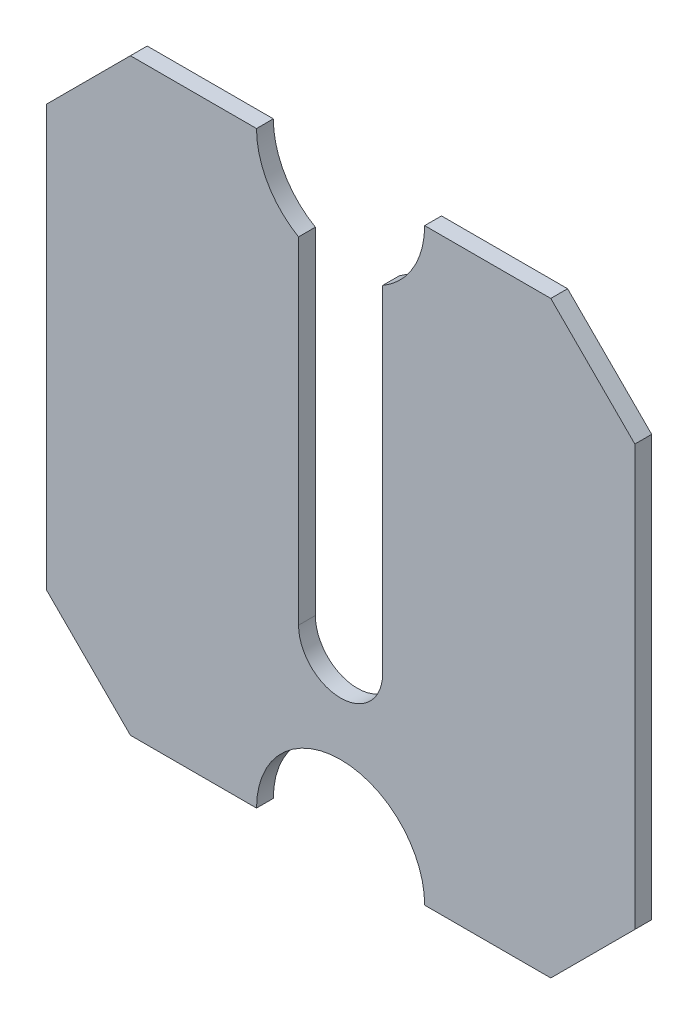
ISO-10303-21;
HEADER;
FILE_DESCRIPTION(('STEP AP214'),'2;1');
FILE_NAME('part.step','',(''),(''),'','','');
FILE_SCHEMA(('AUTOMOTIVE_DESIGN { 1 0 10303 214 1 1 1 1 }'));
ENDSEC;
DATA;
#1=APPLICATION_CONTEXT('core data for automotive mechanical design processes');
#2=APPLICATION_PROTOCOL_DEFINITION('international standard','automotive_design',2000,#1);
#3=PRODUCT_CONTEXT('',#1,'mechanical');
#4=PRODUCT('Part','Part','',(#3));
#5=PRODUCT_RELATED_PRODUCT_CATEGORY('part','',(#4));
#6=PRODUCT_DEFINITION_FORMATION('','',#4);
#7=PRODUCT_DEFINITION_CONTEXT('part definition',#1,'design');
#8=PRODUCT_DEFINITION('design','',#6,#7);
#9=PRODUCT_DEFINITION_SHAPE('','',#8);
#10=(LENGTH_UNIT() NAMED_UNIT(*) SI_UNIT(.MILLI.,.METRE.));
#11=(NAMED_UNIT(*) PLANE_ANGLE_UNIT() SI_UNIT($,.RADIAN.));
#12=(NAMED_UNIT(*) SI_UNIT($,.STERADIAN.) SOLID_ANGLE_UNIT());
#13=UNCERTAINTY_MEASURE_WITH_UNIT(LENGTH_MEASURE(1.E-05),#10,'distance_accuracy_value','');
#14=(GEOMETRIC_REPRESENTATION_CONTEXT(3) GLOBAL_UNCERTAINTY_ASSIGNED_CONTEXT((#13)) GLOBAL_UNIT_ASSIGNED_CONTEXT((#10,
#11,#12)) REPRESENTATION_CONTEXT('',''));
#15=CARTESIAN_POINT('',(0.,0.,0.));
#16=DIRECTION('',(0.,0.,1.));
#17=DIRECTION('',(1.,0.,0.));
#18=AXIS2_PLACEMENT_3D('',#15,#16,#17);
#19=CARTESIAN_POINT('',(-150.412459493557,24.5875405064432,10.));
#20=DIRECTION('',(0.,0.,-1.));
#21=DIRECTION('',(-1.,0.,0.));
#22=AXIS2_PLACEMENT_3D('',#19,#20,#21);
#23=CYLINDRICAL_SURFACE('',#22,50.);
#24=CARTESIAN_POINT('',(-150.412459493557,24.5875405064432,0.));
#25=DIRECTION('',(0.,0.,-1.));
#26=DIRECTION('',(1.,0.,0.));
#27=AXIS2_PLACEMENT_3D('',#24,#25,#26);
#28=CIRCLE('',#27,50.);
#29=CARTESIAN_POINT('',(-200.412459493557,24.5875405064432,0.));
#30=VERTEX_POINT('',#29);
#31=CARTESIAN_POINT('',(-100.412459493557,24.5875405064432,0.));
#32=VERTEX_POINT('',#31);
#33=EDGE_CURVE('E180',#30,#32,#28,.T.);
#34=ORIENTED_EDGE('',*,*,#33,.T.);
#35=DIRECTION('',(0.,0.,-1.));
#36=VECTOR('',#35,1.);
#37=CARTESIAN_POINT('',(-100.412459493557,24.5875405064432,10.));
#38=LINE('',#37,#36);
#39=CARTESIAN_POINT('',(-100.412459493557,24.5875405064432,10.));
#40=VERTEX_POINT('',#39);
#41=EDGE_CURVE('E11',#40,#32,#38,.T.);
#42=ORIENTED_EDGE('',*,*,#41,.F.);
#43=CARTESIAN_POINT('',(-150.412459493557,24.5875405064432,10.));
#44=DIRECTION('',(0.,0.,-1.));
#45=DIRECTION('',(1.,0.,0.));
#46=AXIS2_PLACEMENT_3D('',#43,#44,#45);
#47=CIRCLE('',#46,50.);
#48=CARTESIAN_POINT('',(-200.412459493557,24.5875405064432,10.));
#49=VERTEX_POINT('',#48);
#50=EDGE_CURVE('E210',#49,#40,#47,.T.);
#51=ORIENTED_EDGE('',*,*,#50,.F.);
#52=DIRECTION('',(0.,0.,-1.));
#53=VECTOR('',#52,1.);
#54=CARTESIAN_POINT('',(-200.412459493557,24.5875405064432,10.));
#55=LINE('',#54,#53);
#56=EDGE_CURVE('E176',#49,#30,#55,.T.);
#57=ORIENTED_EDGE('',*,*,#56,.T.);
#58=EDGE_LOOP('',(#34,#42,#51,#57));
#59=FACE_BOUND('',#58,.T.);
#60=ADVANCED_FACE('F36',(#59),#23,.F.);
#61=CARTESIAN_POINT('',(-100.412459493557,24.5875405064432,10.));
#62=DIRECTION('',(0.,1.,0.));
#63=DIRECTION('',(0.,0.,1.));
#64=AXIS2_PLACEMENT_3D('',#61,#62,#63);
#65=PLANE('',#64);
#66=DIRECTION('',(1.,0.,0.));
#67=VECTOR('',#66,1.);
#68=CARTESIAN_POINT('',(-100.412459493557,24.5875405064432,0.));
#69=LINE('',#68,#67);
#70=CARTESIAN_POINT('',(-25.4124594935567,24.5875405064432,0.));
#71=VERTEX_POINT('',#70);
#72=EDGE_CURVE('E183',#32,#71,#69,.T.);
#73=ORIENTED_EDGE('',*,*,#72,.T.);
#74=DIRECTION('',(0.,0.,-1.));
#75=VECTOR('',#74,1.);
#76=CARTESIAN_POINT('',(-25.4124594935567,24.5875405064432,10.));
#77=LINE('',#76,#75);
#78=CARTESIAN_POINT('',(-25.4124594935567,24.5875405064432,10.));
#79=VERTEX_POINT('',#78);
#80=EDGE_CURVE('E44',#79,#71,#77,.T.);
#81=ORIENTED_EDGE('',*,*,#80,.F.);
#82=DIRECTION('',(1.,0.,0.));
#83=VECTOR('',#82,1.);
#84=CARTESIAN_POINT('',(-100.412459493557,24.5875405064432,10.));
#85=LINE('',#84,#83);
#86=EDGE_CURVE('E119',#40,#79,#85,.T.);
#87=ORIENTED_EDGE('',*,*,#86,.F.);
#88=ORIENTED_EDGE('',*,*,#41,.T.);
#89=EDGE_LOOP('',(#73,#81,#87,#88));
#90=FACE_BOUND('',#89,.T.);
#91=ADVANCED_FACE('F308',(#90),#65,.F.);
#92=CARTESIAN_POINT('',(-25.4124594935567,24.5875405064432,10.));
#93=DIRECTION('',(-0.707106781186547,0.707106781186548,0.));
#94=DIRECTION('',(-0.707106781186548,-0.707106781186547,0.));
#95=AXIS2_PLACEMENT_3D('',#92,#93,#94);
#96=PLANE('',#95);
#97=DIRECTION('',(0.707106781186548,0.707106781186547,0.));
#98=VECTOR('',#97,1.);
#99=CARTESIAN_POINT('',(-25.4124594935567,24.5875405064432,0.));
#100=LINE('',#99,#98);
#101=CARTESIAN_POINT('',(24.5875405064433,74.5875405064432,0.));
#102=VERTEX_POINT('',#101);
#103=EDGE_CURVE('E185',#71,#102,#100,.T.);
#104=ORIENTED_EDGE('',*,*,#103,.T.);
#105=DIRECTION('',(0.,0.,-1.));
#106=VECTOR('',#105,1.);
#107=CARTESIAN_POINT('',(24.5875405064433,74.5875405064432,10.));
#108=LINE('',#107,#106);
#109=CARTESIAN_POINT('',(24.5875405064433,74.5875405064432,10.));
#110=VERTEX_POINT('',#109);
#111=EDGE_CURVE('E241',#110,#102,#108,.T.);
#112=ORIENTED_EDGE('',*,*,#111,.F.);
#113=DIRECTION('',(0.707106781186548,0.707106781186547,0.));
#114=VECTOR('',#113,1.);
#115=CARTESIAN_POINT('',(-25.4124594935567,24.5875405064432,10.));
#116=LINE('',#115,#114);
#117=EDGE_CURVE('E249',#79,#110,#116,.T.);
#118=ORIENTED_EDGE('',*,*,#117,.F.);
#119=ORIENTED_EDGE('',*,*,#80,.T.);
#120=EDGE_LOOP('',(#104,#112,#118,#119));
#121=FACE_BOUND('',#120,.T.);
#122=ADVANCED_FACE('F247',(#121),#96,.F.);
#123=CARTESIAN_POINT('',(24.5875405064433,74.5875405064432,10.));
#124=DIRECTION('',(-1.,0.,0.));
#125=DIRECTION('',(0.,0.,1.));
#126=AXIS2_PLACEMENT_3D('',#123,#124,#125);
#127=PLANE('',#126);
#128=DIRECTION('',(0.,1.,0.));
#129=VECTOR('',#128,1.);
#130=CARTESIAN_POINT('',(24.5875405064433,74.5875405064432,0.));
#131=LINE('',#130,#129);
#132=CARTESIAN_POINT('',(24.5875405064433,324.587540506443,0.));
#133=VERTEX_POINT('',#132);
#134=EDGE_CURVE('E187',#102,#133,#131,.T.);
#135=ORIENTED_EDGE('',*,*,#134,.T.);
#136=DIRECTION('',(0.,0.,-1.));
#137=VECTOR('',#136,1.);
#138=CARTESIAN_POINT('',(24.5875405064433,324.587540506443,10.));
#139=LINE('',#138,#137);
#140=CARTESIAN_POINT('',(24.5875405064433,324.587540506443,10.));
#141=VERTEX_POINT('',#140);
#142=EDGE_CURVE('E238',#141,#133,#139,.T.);
#143=ORIENTED_EDGE('',*,*,#142,.F.);
#144=DIRECTION('',(0.,1.,0.));
#145=VECTOR('',#144,1.);
#146=CARTESIAN_POINT('',(24.5875405064433,74.5875405064432,10.));
#147=LINE('',#146,#145);
#148=EDGE_CURVE('E267',#110,#141,#147,.T.);
#149=ORIENTED_EDGE('',*,*,#148,.F.);
#150=ORIENTED_EDGE('',*,*,#111,.T.);
#151=EDGE_LOOP('',(#135,#143,#149,#150));
#152=FACE_BOUND('',#151,.T.);
#153=ADVANCED_FACE('F258',(#152),#127,.F.);
#154=CARTESIAN_POINT('',(-25.4124594935566,374.587540506443,10.));
#155=DIRECTION('',(-0.707106781186547,-0.707106781186548,0.));
#156=DIRECTION('',(0.707106781186548,-0.707106781186547,0.));
#157=AXIS2_PLACEMENT_3D('',#154,#155,#156);
#158=PLANE('',#157);
#159=DIRECTION('',(-0.707106781186548,0.707106781186547,0.));
#160=VECTOR('',#159,1.);
#161=CARTESIAN_POINT('',(-25.4124594935566,374.587540506443,0.));
#162=LINE('',#161,#160);
#163=CARTESIAN_POINT('',(-25.4124594935566,374.587540506443,0.));
#164=VERTEX_POINT('',#163);
#165=EDGE_CURVE('E189',#133,#164,#162,.T.);
#166=ORIENTED_EDGE('',*,*,#165,.T.);
#167=DIRECTION('',(0.,0.,-1.));
#168=VECTOR('',#167,1.);
#169=CARTESIAN_POINT('',(-25.4124594935566,374.587540506443,10.));
#170=LINE('',#169,#168);
#171=CARTESIAN_POINT('',(-25.4124594935566,374.587540506443,10.));
#172=VERTEX_POINT('',#171);
#173=EDGE_CURVE('E235',#172,#164,#170,.T.);
#174=ORIENTED_EDGE('',*,*,#173,.F.);
#175=DIRECTION('',(-0.707106781186548,0.707106781186547,0.));
#176=VECTOR('',#175,1.);
#177=CARTESIAN_POINT('',(-25.4124594935566,374.587540506443,10.));
#178=LINE('',#177,#176);
#179=EDGE_CURVE('E264',#141,#172,#178,.T.);
#180=ORIENTED_EDGE('',*,*,#179,.F.);
#181=ORIENTED_EDGE('',*,*,#142,.T.);
#182=EDGE_LOOP('',(#166,#174,#180,#181));
#183=FACE_BOUND('',#182,.T.);
#184=ADVANCED_FACE('F262',(#183),#158,.F.);
#185=CARTESIAN_POINT('',(-25.4124594935566,374.587540506443,10.));
#186=DIRECTION('',(0.,-1.,0.));
#187=DIRECTION('',(0.,0.,-1.));
#188=AXIS2_PLACEMENT_3D('',#185,#186,#187);
#189=PLANE('',#188);
#190=DIRECTION('',(-1.,0.,0.));
#191=VECTOR('',#190,1.);
#192=CARTESIAN_POINT('',(-25.4124594935566,374.587540506443,0.));
#193=LINE('',#192,#191);
#194=CARTESIAN_POINT('',(-100.412459493557,374.587540506443,0.));
#195=VERTEX_POINT('',#194);
#196=EDGE_CURVE('E191',#164,#195,#193,.T.);
#197=ORIENTED_EDGE('',*,*,#196,.T.);
#198=DIRECTION('',(0.,0.,-1.));
#199=VECTOR('',#198,1.);
#200=CARTESIAN_POINT('',(-100.412459493557,374.587540506443,10.));
#201=LINE('',#200,#199);
#202=CARTESIAN_POINT('',(-100.412459493557,374.587540506443,10.));
#203=VERTEX_POINT('',#202);
#204=EDGE_CURVE('E232',#203,#195,#201,.T.);
#205=ORIENTED_EDGE('',*,*,#204,.F.);
#206=DIRECTION('',(-1.,0.,0.));
#207=VECTOR('',#206,1.);
#208=CARTESIAN_POINT('',(-25.4124594935566,374.587540506443,10.));
#209=LINE('',#208,#207);
#210=EDGE_CURVE('E266',#172,#203,#209,.T.);
#211=ORIENTED_EDGE('',*,*,#210,.F.);
#212=ORIENTED_EDGE('',*,*,#173,.T.);
#213=EDGE_LOOP('',(#197,#205,#211,#212));
#214=FACE_BOUND('',#213,.T.);
#215=ADVANCED_FACE('F321',(#214),#189,.F.);
#216=CARTESIAN_POINT('',(-150.412459493557,374.587540506443,10.));
#217=DIRECTION('',(0.,0.,-1.));
#218=DIRECTION('',(-1.,0.,0.));
#219=AXIS2_PLACEMENT_3D('',#216,#217,#218);
#220=CYLINDRICAL_SURFACE('',#219,50.);
#221=CARTESIAN_POINT('',(-150.412459493557,374.587540506443,0.));
#222=DIRECTION('',(0.,0.,-1.));
#223=DIRECTION('',(1.,0.,0.));
#224=AXIS2_PLACEMENT_3D('',#221,#222,#223);
#225=CIRCLE('',#224,50.);
#226=CARTESIAN_POINT('',(-125.412459493557,331.286270317221,0.));
#227=VERTEX_POINT('',#226);
#228=EDGE_CURVE('E193',#195,#227,#225,.T.);
#229=ORIENTED_EDGE('',*,*,#228,.T.);
#230=DIRECTION('',(0.,0.,-1.));
#231=VECTOR('',#230,1.);
#232=CARTESIAN_POINT('',(-125.412459493557,331.286270317221,10.));
#233=LINE('',#232,#231);
#234=CARTESIAN_POINT('',(-125.412459493557,331.286270317221,10.));
#235=VERTEX_POINT('',#234);
#236=EDGE_CURVE('E229',#235,#227,#233,.T.);
#237=ORIENTED_EDGE('',*,*,#236,.F.);
#238=CARTESIAN_POINT('',(-150.412459493557,374.587540506443,10.));
#239=DIRECTION('',(0.,0.,-1.));
#240=DIRECTION('',(1.,0.,0.));
#241=AXIS2_PLACEMENT_3D('',#238,#239,#240);
#242=CIRCLE('',#241,50.);
#243=EDGE_CURVE('E269',#203,#235,#242,.T.);
#244=ORIENTED_EDGE('',*,*,#243,.F.);
#245=ORIENTED_EDGE('',*,*,#204,.T.);
#246=EDGE_LOOP('',(#229,#237,#244,#245));
#247=FACE_BOUND('',#246,.T.);
#248=ADVANCED_FACE('F324',(#247),#220,.F.);
#249=CARTESIAN_POINT('',(-125.412459493557,331.286270317221,10.));
#250=DIRECTION('',(1.,0.,0.));
#251=DIRECTION('',(0.,1.,0.));
#252=AXIS2_PLACEMENT_3D('',#249,#250,#251);
#253=PLANE('',#252);
#254=DIRECTION('',(0.,-1.,0.));
#255=VECTOR('',#254,1.);
#256=CARTESIAN_POINT('',(-125.412459493557,331.286270317221,0.));
#257=LINE('',#256,#255);
#258=CARTESIAN_POINT('',(-125.412459493557,131.286270317221,0.));
#259=VERTEX_POINT('',#258);
#260=EDGE_CURVE('E195',#227,#259,#257,.T.);
#261=ORIENTED_EDGE('',*,*,#260,.T.);
#262=DIRECTION('',(0.,0.,-1.));
#263=VECTOR('',#262,1.);
#264=CARTESIAN_POINT('',(-125.412459493557,131.286270317221,10.));
#265=LINE('',#264,#263);
#266=CARTESIAN_POINT('',(-125.412459493557,131.286270317221,10.));
#267=VERTEX_POINT('',#266);
#268=EDGE_CURVE('E226',#267,#259,#265,.T.);
#269=ORIENTED_EDGE('',*,*,#268,.F.);
#270=DIRECTION('',(0.,-1.,0.));
#271=VECTOR('',#270,1.);
#272=CARTESIAN_POINT('',(-125.412459493557,331.286270317221,10.));
#273=LINE('',#272,#271);
#274=EDGE_CURVE('E275',#235,#267,#273,.T.);
#275=ORIENTED_EDGE('',*,*,#274,.F.);
#276=ORIENTED_EDGE('',*,*,#236,.T.);
#277=EDGE_LOOP('',(#261,#269,#275,#276));
#278=FACE_BOUND('',#277,.T.);
#279=ADVANCED_FACE('F328',(#278),#253,.F.);
#280=CARTESIAN_POINT('',(-150.412459493557,131.286270317221,10.));
#281=DIRECTION('',(0.,0.,-1.));
#282=DIRECTION('',(-1.,0.,0.));
#283=AXIS2_PLACEMENT_3D('',#280,#281,#282);
#284=CYLINDRICAL_SURFACE('',#283,25.);
#285=CARTESIAN_POINT('',(-150.412459493557,131.286270317221,0.));
#286=DIRECTION('',(0.,0.,-1.));
#287=DIRECTION('',(1.,0.,0.));
#288=AXIS2_PLACEMENT_3D('',#285,#286,#287);
#289=CIRCLE('',#288,25.);
#290=CARTESIAN_POINT('',(-175.412459493557,131.286270317221,0.));
#291=VERTEX_POINT('',#290);
#292=EDGE_CURVE('E197',#259,#291,#289,.T.);
#293=ORIENTED_EDGE('',*,*,#292,.T.);
#294=DIRECTION('',(0.,0.,-1.));
#295=VECTOR('',#294,1.);
#296=CARTESIAN_POINT('',(-175.412459493557,131.286270317221,10.));
#297=LINE('',#296,#295);
#298=CARTESIAN_POINT('',(-175.412459493557,131.286270317221,10.));
#299=VERTEX_POINT('',#298);
#300=EDGE_CURVE('E223',#299,#291,#297,.T.);
#301=ORIENTED_EDGE('',*,*,#300,.F.);
#302=CARTESIAN_POINT('',(-150.412459493557,131.286270317221,10.));
#303=DIRECTION('',(0.,0.,-1.));
#304=DIRECTION('',(1.,0.,0.));
#305=AXIS2_PLACEMENT_3D('',#302,#303,#304);
#306=CIRCLE('',#305,25.);
#307=EDGE_CURVE('E277',#267,#299,#306,.T.);
#308=ORIENTED_EDGE('',*,*,#307,.F.);
#309=ORIENTED_EDGE('',*,*,#268,.T.);
#310=EDGE_LOOP('',(#293,#301,#308,#309));
#311=FACE_BOUND('',#310,.T.);
#312=ADVANCED_FACE('F332',(#311),#284,.F.);
#313=CARTESIAN_POINT('',(-175.412459493557,331.286270317221,10.));
#314=DIRECTION('',(-1.,0.,0.));
#315=DIRECTION('',(0.,-1.,0.));
#316=AXIS2_PLACEMENT_3D('',#313,#314,#315);
#317=PLANE('',#316);
#318=DIRECTION('',(0.,1.,0.));
#319=VECTOR('',#318,1.);
#320=CARTESIAN_POINT('',(-175.412459493557,331.286270317221,0.));
#321=LINE('',#320,#319);
#322=CARTESIAN_POINT('',(-175.412459493557,331.286270317221,0.));
#323=VERTEX_POINT('',#322);
#324=EDGE_CURVE('E199',#291,#323,#321,.T.);
#325=ORIENTED_EDGE('',*,*,#324,.T.);
#326=DIRECTION('',(0.,0.,-1.));
#327=VECTOR('',#326,1.);
#328=CARTESIAN_POINT('',(-175.412459493557,331.286270317221,10.));
#329=LINE('',#328,#327);
#330=CARTESIAN_POINT('',(-175.412459493557,331.286270317221,10.));
#331=VERTEX_POINT('',#330);
#332=EDGE_CURVE('E220',#331,#323,#329,.T.);
#333=ORIENTED_EDGE('',*,*,#332,.F.);
#334=DIRECTION('',(0.,1.,0.));
#335=VECTOR('',#334,1.);
#336=CARTESIAN_POINT('',(-175.412459493557,331.286270317221,10.));
#337=LINE('',#336,#335);
#338=EDGE_CURVE('E279',#299,#331,#337,.T.);
#339=ORIENTED_EDGE('',*,*,#338,.F.);
#340=ORIENTED_EDGE('',*,*,#300,.T.);
#341=EDGE_LOOP('',(#325,#333,#339,#340));
#342=FACE_BOUND('',#341,.T.);
#343=ADVANCED_FACE('F336',(#342),#317,.F.);
#344=CARTESIAN_POINT('',(-150.412459493557,374.587540506443,10.));
#345=DIRECTION('',(0.,0.,-1.));
#346=DIRECTION('',(-1.,0.,0.));
#347=AXIS2_PLACEMENT_3D('',#344,#345,#346);
#348=CYLINDRICAL_SURFACE('',#347,50.);
#349=CARTESIAN_POINT('',(-150.412459493557,374.587540506443,0.));
#350=DIRECTION('',(0.,0.,-1.));
#351=DIRECTION('',(1.,0.,0.));
#352=AXIS2_PLACEMENT_3D('',#349,#350,#351);
#353=CIRCLE('',#352,50.);
#354=CARTESIAN_POINT('',(-200.412459493557,374.587540506443,0.));
#355=VERTEX_POINT('',#354);
#356=EDGE_CURVE('E201',#323,#355,#353,.T.);
#357=ORIENTED_EDGE('',*,*,#356,.T.);
#358=DIRECTION('',(0.,0.,-1.));
#359=VECTOR('',#358,1.);
#360=CARTESIAN_POINT('',(-200.412459493557,374.587540506443,10.));
#361=LINE('',#360,#359);
#362=CARTESIAN_POINT('',(-200.412459493557,374.587540506443,10.));
#363=VERTEX_POINT('',#362);
#364=EDGE_CURVE('E217',#363,#355,#361,.T.);
#365=ORIENTED_EDGE('',*,*,#364,.F.);
#366=CARTESIAN_POINT('',(-150.412459493557,374.587540506443,10.));
#367=DIRECTION('',(0.,0.,-1.));
#368=DIRECTION('',(1.,0.,0.));
#369=AXIS2_PLACEMENT_3D('',#366,#367,#368);
#370=CIRCLE('',#369,50.);
#371=EDGE_CURVE('E281',#331,#363,#370,.T.);
#372=ORIENTED_EDGE('',*,*,#371,.F.);
#373=ORIENTED_EDGE('',*,*,#332,.T.);
#374=EDGE_LOOP('',(#357,#365,#372,#373));
#375=FACE_BOUND('',#374,.T.);
#376=ADVANCED_FACE('F340',(#375),#348,.F.);
#377=CARTESIAN_POINT('',(-200.412459493557,374.587540506443,10.));
#378=DIRECTION('',(0.,-1.,0.));
#379=DIRECTION('',(0.,0.,-1.));
#380=AXIS2_PLACEMENT_3D('',#377,#378,#379);
#381=PLANE('',#380);
#382=DIRECTION('',(-1.,0.,0.));
#383=VECTOR('',#382,1.);
#384=CARTESIAN_POINT('',(-200.412459493557,374.587540506443,0.));
#385=LINE('',#384,#383);
#386=CARTESIAN_POINT('',(-275.412459493557,374.587540506443,0.));
#387=VERTEX_POINT('',#386);
#388=EDGE_CURVE('E203',#355,#387,#385,.T.);
#389=ORIENTED_EDGE('',*,*,#388,.T.);
#390=DIRECTION('',(0.,0.,-1.));
#391=VECTOR('',#390,1.);
#392=CARTESIAN_POINT('',(-275.412459493557,374.587540506443,10.));
#393=LINE('',#392,#391);
#394=CARTESIAN_POINT('',(-275.412459493557,374.587540506443,10.));
#395=VERTEX_POINT('',#394);
#396=EDGE_CURVE('E214',#395,#387,#393,.T.);
#397=ORIENTED_EDGE('',*,*,#396,.F.);
#398=DIRECTION('',(-1.,0.,0.));
#399=VECTOR('',#398,1.);
#400=CARTESIAN_POINT('',(-200.412459493557,374.587540506443,10.));
#401=LINE('',#400,#399);
#402=EDGE_CURVE('E283',#363,#395,#401,.T.);
#403=ORIENTED_EDGE('',*,*,#402,.F.);
#404=ORIENTED_EDGE('',*,*,#364,.T.);
#405=EDGE_LOOP('',(#389,#397,#403,#404));
#406=FACE_BOUND('',#405,.T.);
#407=ADVANCED_FACE('F289',(#406),#381,.F.);
#408=CARTESIAN_POINT('',(-275.412459493557,374.587540506443,10.));
#409=DIRECTION('',(0.707106781186547,-0.707106781186548,0.));
#410=DIRECTION('',(0.707106781186548,0.707106781186547,0.));
#411=AXIS2_PLACEMENT_3D('',#408,#409,#410);
#412=PLANE('',#411);
#413=DIRECTION('',(-0.707106781186548,-0.707106781186547,0.));
#414=VECTOR('',#413,1.);
#415=CARTESIAN_POINT('',(-275.412459493557,374.587540506443,0.));
#416=LINE('',#415,#414);
#417=CARTESIAN_POINT('',(-325.412459493557,324.587540506443,0.));
#418=VERTEX_POINT('',#417);
#419=EDGE_CURVE('E205',#387,#418,#416,.T.);
#420=ORIENTED_EDGE('',*,*,#419,.T.);
#421=DIRECTION('',(0.,0.,-1.));
#422=VECTOR('',#421,1.);
#423=CARTESIAN_POINT('',(-325.412459493557,324.587540506443,10.));
#424=LINE('',#423,#422);
#425=CARTESIAN_POINT('',(-325.412459493557,324.587540506443,10.));
#426=VERTEX_POINT('',#425);
#427=EDGE_CURVE('E171',#426,#418,#424,.T.);
#428=ORIENTED_EDGE('',*,*,#427,.F.);
#429=DIRECTION('',(-0.707106781186548,-0.707106781186547,0.));
#430=VECTOR('',#429,1.);
#431=CARTESIAN_POINT('',(-275.412459493557,374.587540506443,10.));
#432=LINE('',#431,#430);
#433=EDGE_CURVE('E162',#395,#426,#432,.T.);
#434=ORIENTED_EDGE('',*,*,#433,.F.);
#435=ORIENTED_EDGE('',*,*,#396,.T.);
#436=EDGE_LOOP('',(#420,#428,#434,#435));
#437=FACE_BOUND('',#436,.T.);
#438=ADVANCED_FACE('F293',(#437),#412,.F.);
#439=CARTESIAN_POINT('',(-325.412459493557,74.5875405064432,10.));
#440=DIRECTION('',(1.,0.,0.));
#441=DIRECTION('',(0.,0.,-1.));
#442=AXIS2_PLACEMENT_3D('',#439,#440,#441);
#443=PLANE('',#442);
#444=DIRECTION('',(0.,-1.,0.));
#445=VECTOR('',#444,1.);
#446=CARTESIAN_POINT('',(-325.412459493557,74.5875405064432,0.));
#447=LINE('',#446,#445);
#448=CARTESIAN_POINT('',(-325.412459493557,74.5875405064432,0.));
#449=VERTEX_POINT('',#448);
#450=EDGE_CURVE('E170',#418,#449,#447,.T.);
#451=ORIENTED_EDGE('',*,*,#450,.T.);
#452=DIRECTION('',(0.,0.,-1.));
#453=VECTOR('',#452,1.);
#454=CARTESIAN_POINT('',(-325.412459493557,74.5875405064432,10.));
#455=LINE('',#454,#453);
#456=CARTESIAN_POINT('',(-325.412459493557,74.5875405064432,10.));
#457=VERTEX_POINT('',#456);
#458=EDGE_CURVE('E167',#457,#449,#455,.T.);
#459=ORIENTED_EDGE('',*,*,#458,.F.);
#460=DIRECTION('',(0.,-1.,0.));
#461=VECTOR('',#460,1.);
#462=CARTESIAN_POINT('',(-325.412459493557,74.5875405064432,10.));
#463=LINE('',#462,#461);
#464=EDGE_CURVE('E156',#426,#457,#463,.T.);
#465=ORIENTED_EDGE('',*,*,#464,.F.);
#466=ORIENTED_EDGE('',*,*,#427,.T.);
#467=EDGE_LOOP('',(#451,#459,#465,#466));
#468=FACE_BOUND('',#467,.T.);
#469=ADVANCED_FACE('F168',(#468),#443,.F.);
#470=CARTESIAN_POINT('',(-275.412459493557,24.5875405064432,10.));
#471=DIRECTION('',(0.707106781186548,0.707106781186548,0.));
#472=DIRECTION('',(-0.707106781186548,0.707106781186548,0.));
#473=AXIS2_PLACEMENT_3D('',#470,#471,#472);
#474=PLANE('',#473);
#475=DIRECTION('',(0.707106781186547,-0.707106781186547,0.));
#476=VECTOR('',#475,1.);
#477=CARTESIAN_POINT('',(-275.412459493557,24.5875405064432,0.));
#478=LINE('',#477,#476);
#479=CARTESIAN_POINT('',(-275.412459493557,24.5875405064432,0.));
#480=VERTEX_POINT('',#479);
#481=EDGE_CURVE('E105',#449,#480,#478,.T.);
#482=ORIENTED_EDGE('',*,*,#481,.T.);
#483=DIRECTION('',(0.,0.,-1.));
#484=VECTOR('',#483,1.);
#485=CARTESIAN_POINT('',(-275.412459493557,24.5875405064432,10.));
#486=LINE('',#485,#484);
#487=CARTESIAN_POINT('',(-275.412459493557,24.5875405064432,10.));
#488=VERTEX_POINT('',#487);
#489=EDGE_CURVE('E172',#488,#480,#486,.T.);
#490=ORIENTED_EDGE('',*,*,#489,.F.);
#491=DIRECTION('',(0.707106781186547,-0.707106781186547,0.));
#492=VECTOR('',#491,1.);
#493=CARTESIAN_POINT('',(-275.412459493557,24.5875405064432,10.));
#494=LINE('',#493,#492);
#495=EDGE_CURVE('E160',#457,#488,#494,.T.);
#496=ORIENTED_EDGE('',*,*,#495,.F.);
#497=ORIENTED_EDGE('',*,*,#458,.T.);
#498=EDGE_LOOP('',(#482,#490,#496,#497));
#499=FACE_BOUND('',#498,.T.);
#500=ADVANCED_FACE('F174',(#499),#474,.F.);
#501=CARTESIAN_POINT('',(-275.412459493557,24.5875405064432,10.));
#502=DIRECTION('',(0.,1.,0.));
#503=DIRECTION('',(0.,0.,1.));
#504=AXIS2_PLACEMENT_3D('',#501,#502,#503);
#505=PLANE('',#504);
#506=DIRECTION('',(1.,0.,0.));
#507=VECTOR('',#506,1.);
#508=CARTESIAN_POINT('',(-275.412459493557,24.5875405064432,0.));
#509=LINE('',#508,#507);
#510=EDGE_CURVE('E111',#480,#30,#509,.T.);
#511=ORIENTED_EDGE('',*,*,#510,.T.);
#512=ORIENTED_EDGE('',*,*,#56,.F.);
#513=DIRECTION('',(1.,0.,0.));
#514=VECTOR('',#513,1.);
#515=CARTESIAN_POINT('',(-275.412459493557,24.5875405064432,10.));
#516=LINE('',#515,#514);
#517=EDGE_CURVE('E52',#488,#49,#516,.T.);
#518=ORIENTED_EDGE('',*,*,#517,.F.);
#519=ORIENTED_EDGE('',*,*,#489,.T.);
#520=EDGE_LOOP('',(#511,#512,#518,#519));
#521=FACE_BOUND('',#520,.T.);
#522=ADVANCED_FACE('F297',(#521),#505,.F.);
#523=CARTESIAN_POINT('',(-150.412459493557,24.5875405064432,10.));
#524=DIRECTION('',(0.,0.,1.));
#525=DIRECTION('',(1.,0.,0.));
#526=AXIS2_PLACEMENT_3D('',#523,#524,#525);
#527=PLANE('',#526);
#528=ORIENTED_EDGE('',*,*,#50,.T.);
#529=ORIENTED_EDGE('',*,*,#86,.T.);
#530=ORIENTED_EDGE('',*,*,#117,.T.);
#531=ORIENTED_EDGE('',*,*,#148,.T.);
#532=ORIENTED_EDGE('',*,*,#179,.T.);
#533=ORIENTED_EDGE('',*,*,#210,.T.);
#534=ORIENTED_EDGE('',*,*,#243,.T.);
#535=ORIENTED_EDGE('',*,*,#274,.T.);
#536=ORIENTED_EDGE('',*,*,#307,.T.);
#537=ORIENTED_EDGE('',*,*,#338,.T.);
#538=ORIENTED_EDGE('',*,*,#371,.T.);
#539=ORIENTED_EDGE('',*,*,#402,.T.);
#540=ORIENTED_EDGE('',*,*,#433,.T.);
#541=ORIENTED_EDGE('',*,*,#464,.T.);
#542=ORIENTED_EDGE('',*,*,#495,.T.);
#543=ORIENTED_EDGE('',*,*,#517,.T.);
#544=EDGE_LOOP('',(#528,#529,#530,#531,#532,#533,#534,#535,#536,#537,#538,#539,#540,#541,#542,#543));
#545=FACE_BOUND('',#544,.T.);
#546=ADVANCED_FACE('F158',(#545),#527,.T.);
#547=CARTESIAN_POINT('',(-150.412459493557,24.5875405064432,0.));
#548=DIRECTION('',(0.,0.,1.));
#549=DIRECTION('',(1.,0.,0.));
#550=AXIS2_PLACEMENT_3D('',#547,#548,#549);
#551=PLANE('',#550);
#552=ORIENTED_EDGE('',*,*,#33,.F.);
#553=ORIENTED_EDGE('',*,*,#510,.F.);
#554=ORIENTED_EDGE('',*,*,#481,.F.);
#555=ORIENTED_EDGE('',*,*,#450,.F.);
#556=ORIENTED_EDGE('',*,*,#419,.F.);
#557=ORIENTED_EDGE('',*,*,#388,.F.);
#558=ORIENTED_EDGE('',*,*,#356,.F.);
#559=ORIENTED_EDGE('',*,*,#324,.F.);
#560=ORIENTED_EDGE('',*,*,#292,.F.);
#561=ORIENTED_EDGE('',*,*,#260,.F.);
#562=ORIENTED_EDGE('',*,*,#228,.F.);
#563=ORIENTED_EDGE('',*,*,#196,.F.);
#564=ORIENTED_EDGE('',*,*,#165,.F.);
#565=ORIENTED_EDGE('',*,*,#134,.F.);
#566=ORIENTED_EDGE('',*,*,#103,.F.);
#567=ORIENTED_EDGE('',*,*,#72,.F.);
#568=EDGE_LOOP('',(#552,#553,#554,#555,#556,#557,#558,#559,#560,#561,#562,#563,#564,#565,#566,#567));
#569=FACE_BOUND('',#568,.T.);
#570=ADVANCED_FACE('F253',(#569),#551,.F.);
#571=CLOSED_SHELL('',(#60,#91,#122,#153,#184,#215,#248,#279,#312,#343,#376,#407,#438,#469,#500,
#522,#546,#570));
#572=MANIFOLD_SOLID_BREP('B2',#571);
#573=ADVANCED_BREP_SHAPE_REPRESENTATION('',(#18,#572),#14);
#574=SHAPE_DEFINITION_REPRESENTATION(#9,#573);
ENDSEC;
END-ISO-10303-21;
